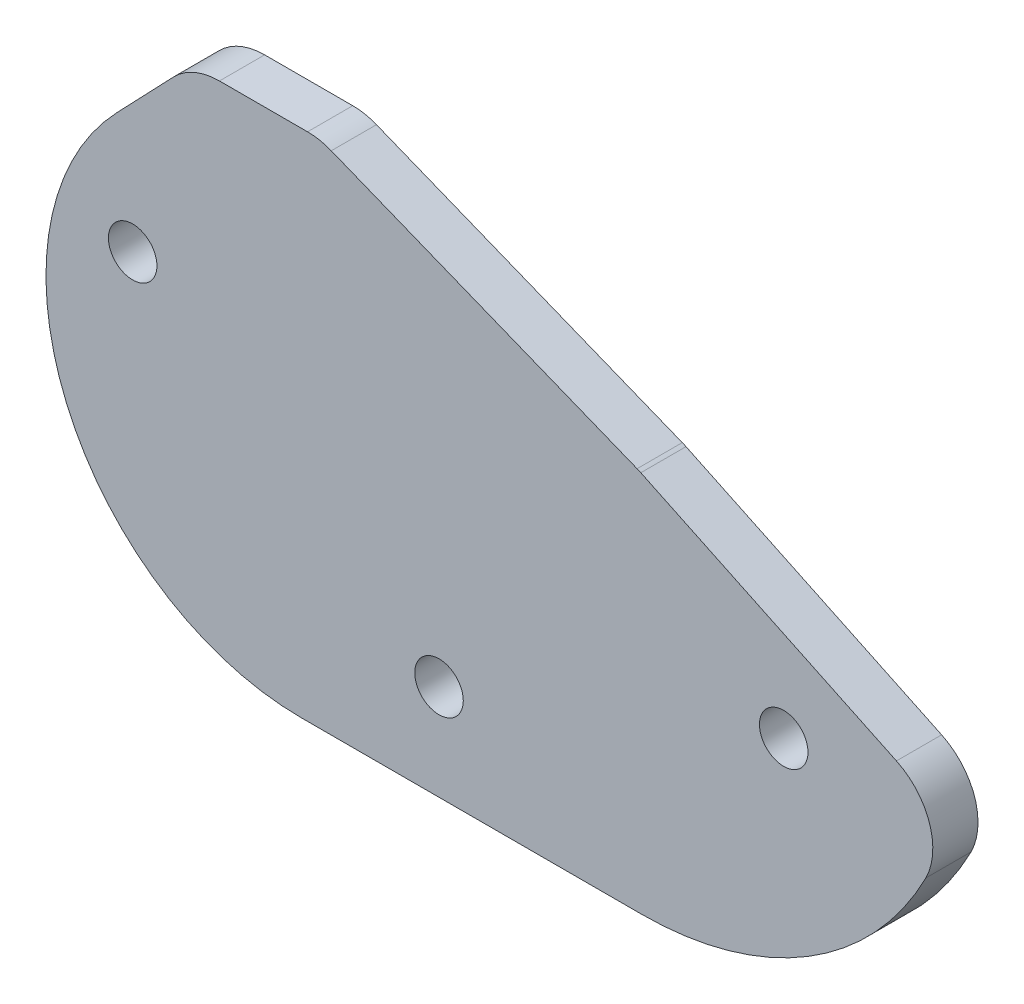
ISO-10303-21;
HEADER;
FILE_DESCRIPTION(('STEP AP214'),'2;1');
FILE_NAME('part.step','',(''),(''),'','','');
FILE_SCHEMA(('AUTOMOTIVE_DESIGN { 1 0 10303 214 1 1 1 1 }'));
ENDSEC;
DATA;
#1=APPLICATION_CONTEXT('core data for automotive mechanical design processes');
#2=APPLICATION_PROTOCOL_DEFINITION('international standard','automotive_design',2000,#1);
#3=PRODUCT_CONTEXT('',#1,'mechanical');
#4=PRODUCT('Part','Part','',(#3));
#5=PRODUCT_RELATED_PRODUCT_CATEGORY('part','',(#4));
#6=PRODUCT_DEFINITION_FORMATION('','',#4);
#7=PRODUCT_DEFINITION_CONTEXT('part definition',#1,'design');
#8=PRODUCT_DEFINITION('design','',#6,#7);
#9=PRODUCT_DEFINITION_SHAPE('','',#8);
#10=(LENGTH_UNIT() NAMED_UNIT(*) SI_UNIT(.MILLI.,.METRE.));
#11=(NAMED_UNIT(*) PLANE_ANGLE_UNIT() SI_UNIT($,.RADIAN.));
#12=(NAMED_UNIT(*) SI_UNIT($,.STERADIAN.) SOLID_ANGLE_UNIT());
#13=UNCERTAINTY_MEASURE_WITH_UNIT(LENGTH_MEASURE(1.E-05),#10,'distance_accuracy_value','');
#14=(GEOMETRIC_REPRESENTATION_CONTEXT(3) GLOBAL_UNCERTAINTY_ASSIGNED_CONTEXT((#13)) GLOBAL_UNIT_ASSIGNED_CONTEXT((#10,
#11,#12)) REPRESENTATION_CONTEXT('',''));
#15=CARTESIAN_POINT('',(0.,0.,0.));
#16=DIRECTION('',(0.,0.,1.));
#17=DIRECTION('',(1.,0.,0.));
#18=AXIS2_PLACEMENT_3D('',#15,#16,#17);
#19=CARTESIAN_POINT('',(101.6,0.,4.4958));
#20=DIRECTION('',(0.,1.,0.));
#21=DIRECTION('',(-1.,0.,0.));
#22=AXIS2_PLACEMENT_3D('',#19,#20,#21);
#23=PLANE('',#22);
#24=DIRECTION('',(0.,0.,1.));
#25=VECTOR('',#24,1.);
#26=CARTESIAN_POINT('',(70.9764049138577,0.,0.));
#27=LINE('',#26,#25);
#28=CARTESIAN_POINT('',(70.9764049138577,0.,0.));
#29=VERTEX_POINT('',#28);
#30=CARTESIAN_POINT('',(70.9764049138577,0.,4.4958));
#31=VERTEX_POINT('',#30);
#32=EDGE_CURVE('E129',#29,#31,#27,.T.);
#33=ORIENTED_EDGE('',*,*,#32,.T.);
#34=DIRECTION('',(1.,0.,0.));
#35=VECTOR('',#34,1.);
#36=CARTESIAN_POINT('',(101.6,0.,4.4958));
#37=LINE('',#36,#35);
#38=CARTESIAN_POINT('',(37.0944442407192,0.,4.4958));
#39=VERTEX_POINT('',#38);
#40=EDGE_CURVE('E161',#39,#31,#37,.T.);
#41=ORIENTED_EDGE('',*,*,#40,.F.);
#42=DIRECTION('',(0.,0.,1.));
#43=VECTOR('',#42,1.);
#44=CARTESIAN_POINT('',(37.0944442407192,0.,0.));
#45=LINE('',#44,#43);
#46=CARTESIAN_POINT('',(37.0944442407192,0.,0.));
#47=VERTEX_POINT('',#46);
#48=EDGE_CURVE('E141',#47,#39,#45,.T.);
#49=ORIENTED_EDGE('',*,*,#48,.F.);
#50=DIRECTION('',(1.,0.,0.));
#51=VECTOR('',#50,1.);
#52=CARTESIAN_POINT('',(101.6,0.,0.));
#53=LINE('',#52,#51);
#54=EDGE_CURVE('E124',#47,#29,#53,.T.);
#55=ORIENTED_EDGE('',*,*,#54,.T.);
#56=EDGE_LOOP('',(#33,#41,#49,#55));
#57=FACE_BOUND('',#56,.T.);
#58=ADVANCED_FACE('F33',(#57),#23,.F.);
#59=CARTESIAN_POINT('',(26.2420825003529,50.8,4.4958));
#60=DIRECTION('',(0.722605301638805,-0.69126086106729,0.));
#61=DIRECTION('',(0.69126086106729,0.722605301638805,0.));
#62=AXIS2_PLACEMENT_3D('',#59,#60,#61);
#63=PLANE('',#62);
#64=DIRECTION('',(-0.69126086106729,-0.722605301638805,0.));
#65=VECTOR('',#64,1.);
#66=CARTESIAN_POINT('',(26.2420825003529,50.8,4.4958));
#67=LINE('',#66,#65);
#68=CARTESIAN_POINT('',(24.366629270038,48.8395064677773,4.4958));
#69=VERTEX_POINT('',#68);
#70=CARTESIAN_POINT('',(18.7402695790936,42.9580258711092,4.4958));
#71=VERTEX_POINT('',#70);
#72=EDGE_CURVE('E152',#69,#71,#67,.T.);
#73=ORIENTED_EDGE('',*,*,#72,.F.);
#74=DIRECTION('',(0.,0.,-1.));
#75=VECTOR('',#74,1.);
#76=CARTESIAN_POINT('',(24.366629270038,48.8395064677773,4.4958));
#77=LINE('',#76,#75);
#78=CARTESIAN_POINT('',(24.366629270038,48.8395064677773,0.));
#79=VERTEX_POINT('',#78);
#80=EDGE_CURVE('E162',#69,#79,#77,.T.);
#81=ORIENTED_EDGE('',*,*,#80,.T.);
#82=DIRECTION('',(-0.69126086106729,-0.722605301638805,0.));
#83=VECTOR('',#82,1.);
#84=CARTESIAN_POINT('',(26.2420825003529,50.8,0.));
#85=LINE('',#84,#83);
#86=CARTESIAN_POINT('',(18.7402695790935,42.9580258711092,0.));
#87=VERTEX_POINT('',#86);
#88=EDGE_CURVE('E159',#79,#87,#85,.T.);
#89=ORIENTED_EDGE('',*,*,#88,.T.);
#90=DIRECTION('',(0.,0.,1.));
#91=VECTOR('',#90,1.);
#92=CARTESIAN_POINT('',(18.7402695790935,42.9580258711092,0.));
#93=LINE('',#92,#91);
#94=EDGE_CURVE('E235',#87,#71,#93,.T.);
#95=ORIENTED_EDGE('',*,*,#94,.T.);
#96=EDGE_LOOP('',(#73,#81,#89,#95));
#97=FACE_BOUND('',#96,.T.);
#98=ADVANCED_FACE('F249',(#97),#63,.F.);
#99=CARTESIAN_POINT('',(0.,0.,4.4958));
#100=DIRECTION('',(0.,0.,-1.));
#101=DIRECTION('',(-1.,0.,0.));
#102=AXIS2_PLACEMENT_3D('',#99,#100,#101);
#103=PLANE('',#102);
#104=DIRECTION('',(-1.,0.,0.));
#105=VECTOR('',#104,1.);
#106=CARTESIAN_POINT('',(26.2420825003529,50.8,4.4958));
#107=LINE('',#106,#105);
#108=CARTESIAN_POINT('',(37.7183314091178,50.8,4.4958));
#109=VERTEX_POINT('',#108);
#110=CARTESIAN_POINT('',(28.9551729354444,50.8,4.4958));
#111=VERTEX_POINT('',#110);
#112=EDGE_CURVE('E216',#109,#111,#107,.T.);
#113=ORIENTED_EDGE('',*,*,#112,.T.);
#114=CARTESIAN_POINT('',(28.9551729354445,44.45,4.4958));
#115=DIRECTION('',(0.,0.,-1.));
#116=DIRECTION('',(-1.,0.,0.));
#117=AXIS2_PLACEMENT_3D('',#114,#115,#116);
#118=CIRCLE('',#117,6.35);
#119=EDGE_CURVE('E182',#111,#69,#118,.F.);
#120=ORIENTED_EDGE('',*,*,#119,.T.);
#121=ORIENTED_EDGE('',*,*,#72,.T.);
#122=CARTESIAN_POINT('',(37.0944442407192,25.4,4.4958));
#123=DIRECTION('',(0.,0.,-1.));
#124=DIRECTION('',(1.,0.,0.));
#125=AXIS2_PLACEMENT_3D('',#122,#123,#124);
#126=CIRCLE('',#125,25.4);
#127=EDGE_CURVE('E138',#39,#71,#126,.T.);
#128=ORIENTED_EDGE('',*,*,#127,.F.);
#129=ORIENTED_EDGE('',*,*,#40,.T.);
#130=CARTESIAN_POINT('',(70.9764049138577,31.75,4.4958));
#131=DIRECTION('',(0.,0.,-1.));
#132=DIRECTION('',(-1.,0.,0.));
#133=AXIS2_PLACEMENT_3D('',#130,#131,#132);
#134=CIRCLE('',#133,31.75);
#135=CARTESIAN_POINT('',(99.2261027725313,17.2580342639913,4.4958));
#136=VERTEX_POINT('',#135);
#137=EDGE_CURVE('E130',#136,#31,#134,.T.);
#138=ORIENTED_EDGE('',*,*,#137,.F.);
#139=CARTESIAN_POINT('',(93.5761632007966,20.1564274111931,4.4958));
#140=DIRECTION('',(0.,0.,-1.));
#141=DIRECTION('',(-1.,0.,0.));
#142=AXIS2_PLACEMENT_3D('',#139,#140,#141);
#143=CIRCLE('',#142,6.35);
#144=CARTESIAN_POINT('',(96.3069073282395,25.8892745668772,4.4958));
#145=VERTEX_POINT('',#144);
#146=EDGE_CURVE('E177',#136,#145,#143,.F.);
#147=ORIENTED_EDGE('',*,*,#146,.T.);
#148=DIRECTION('',(-0.902810575698297,0.430038445266595,0.));
#149=VECTOR('',#148,1.);
#150=CARTESIAN_POINT('',(70.6920825003529,38.0904602211774,4.4958));
#151=LINE('',#150,#149);
#152=CARTESIAN_POINT('',(70.8749362686987,38.0033609421401,4.4958));
#153=VERTEX_POINT('',#152);
#154=EDGE_CURVE('E194',#145,#153,#151,.T.);
#155=ORIENTED_EDGE('',*,*,#154,.T.);
#156=CARTESIAN_POINT('',(68.1441921412558,32.2705137864559,4.4958));
#157=DIRECTION('',(0.,0.,-1.));
#158=DIRECTION('',(-1.,0.,0.));
#159=AXIS2_PLACEMENT_3D('',#156,#157,#158);
#160=CIRCLE('',#159,6.35);
#161=CARTESIAN_POINT('',(70.5040498474147,38.165729779673,4.4958));
#162=VERTEX_POINT('',#161);
#163=EDGE_CURVE('E55',#153,#162,#160,.F.);
#164=ORIENTED_EDGE('',*,*,#163,.T.);
#165=DIRECTION('',(-0.928380471372771,0.371631134828167,0.));
#166=VECTOR('',#165,1.);
#167=CARTESIAN_POINT('',(38.9420825003529,50.8,4.4958));
#168=LINE('',#167,#166);
#169=CARTESIAN_POINT('',(40.0781891152767,50.3452159932171,4.4958));
#170=VERTEX_POINT('',#169);
#171=EDGE_CURVE('E201',#162,#170,#168,.T.);
#172=ORIENTED_EDGE('',*,*,#171,.T.);
#173=CARTESIAN_POINT('',(37.7183314091178,44.45,4.4958));
#174=DIRECTION('',(0.,0.,-1.));
#175=DIRECTION('',(-1.,0.,0.));
#176=AXIS2_PLACEMENT_3D('',#173,#174,#175);
#177=CIRCLE('',#176,6.35);
#178=EDGE_CURVE('E180',#170,#109,#177,.F.);
#179=ORIENTED_EDGE('',*,*,#178,.T.);
#180=EDGE_LOOP('',(#113,#120,#121,#128,#129,#138,#147,#155,#164,#172,#179));
#181=FACE_BOUND('',#180,.T.);
#182=CARTESIAN_POINT('',(20.32,31.75,4.4958));
#183=DIRECTION('',(0.,0.,1.));
#184=DIRECTION('',(1.,0.,0.));
#185=AXIS2_PLACEMENT_3D('',#182,#183,#184);
#186=CIRCLE('',#185,2.413);
#187=CARTESIAN_POINT('',(22.733,31.75,4.4958));
#188=VERTEX_POINT('',#187);
#189=EDGE_CURVE('E143',#188,#188,#186,.T.);
#190=ORIENTED_EDGE('',*,*,#189,.F.);
#191=EDGE_LOOP('',(#190));
#192=FACE_BOUND('',#191,.T.);
#193=CARTESIAN_POINT('',(50.8,9.52499999999999,4.4958));
#194=DIRECTION('',(0.,0.,1.));
#195=DIRECTION('',(1.,0.,0.));
#196=AXIS2_PLACEMENT_3D('',#193,#194,#195);
#197=CIRCLE('',#196,2.41299999999999);
#198=CARTESIAN_POINT('',(53.213,9.52499999999999,4.4958));
#199=VERTEX_POINT('',#198);
#200=EDGE_CURVE('E222',#199,#199,#197,.T.);
#201=ORIENTED_EDGE('',*,*,#200,.F.);
#202=EDGE_LOOP('',(#201));
#203=FACE_BOUND('',#202,.T.);
#204=CARTESIAN_POINT('',(85.09,22.225,4.4958));
#205=DIRECTION('',(0.,0.,1.));
#206=DIRECTION('',(1.,0.,0.));
#207=AXIS2_PLACEMENT_3D('',#204,#205,#206);
#208=CIRCLE('',#207,2.413);
#209=CARTESIAN_POINT('',(87.503,22.225,4.4958));
#210=VERTEX_POINT('',#209);
#211=EDGE_CURVE('E227',#210,#210,#208,.T.);
#212=ORIENTED_EDGE('',*,*,#211,.F.);
#213=EDGE_LOOP('',(#212));
#214=FACE_BOUND('',#213,.T.);
#215=ADVANCED_FACE('F198',(#181,#192,#203,#214),#103,.F.);
#216=CARTESIAN_POINT('',(0.,0.,0.));
#217=DIRECTION('',(0.,0.,-1.));
#218=DIRECTION('',(-1.,0.,0.));
#219=AXIS2_PLACEMENT_3D('',#216,#217,#218);
#220=PLANE('',#219);
#221=ORIENTED_EDGE('',*,*,#88,.F.);
#222=CARTESIAN_POINT('',(28.9551729354445,44.45,0.));
#223=DIRECTION('',(0.,0.,-1.));
#224=DIRECTION('',(-1.,0.,0.));
#225=AXIS2_PLACEMENT_3D('',#222,#223,#224);
#226=CIRCLE('',#225,6.35);
#227=CARTESIAN_POINT('',(28.9551729354444,50.8,0.));
#228=VERTEX_POINT('',#227);
#229=EDGE_CURVE('E170',#79,#228,#226,.T.);
#230=ORIENTED_EDGE('',*,*,#229,.T.);
#231=DIRECTION('',(-1.,0.,0.));
#232=VECTOR('',#231,1.);
#233=CARTESIAN_POINT('',(26.2420825003529,50.8,0.));
#234=LINE('',#233,#232);
#235=CARTESIAN_POINT('',(37.7183314091178,50.8,0.));
#236=VERTEX_POINT('',#235);
#237=EDGE_CURVE('E156',#236,#228,#234,.T.);
#238=ORIENTED_EDGE('',*,*,#237,.F.);
#239=CARTESIAN_POINT('',(37.7183314091178,44.45,0.));
#240=DIRECTION('',(0.,0.,-1.));
#241=DIRECTION('',(-1.,0.,0.));
#242=AXIS2_PLACEMENT_3D('',#239,#240,#241);
#243=CIRCLE('',#242,6.35);
#244=CARTESIAN_POINT('',(40.0781891152767,50.3452159932171,0.));
#245=VERTEX_POINT('',#244);
#246=EDGE_CURVE('E168',#236,#245,#243,.T.);
#247=ORIENTED_EDGE('',*,*,#246,.T.);
#248=DIRECTION('',(-0.928380471372771,0.371631134828167,0.));
#249=VECTOR('',#248,1.);
#250=CARTESIAN_POINT('',(38.9420825003529,50.8,0.));
#251=LINE('',#250,#249);
#252=CARTESIAN_POINT('',(70.5040498474147,38.165729779673,0.));
#253=VERTEX_POINT('',#252);
#254=EDGE_CURVE('E146',#253,#245,#251,.T.);
#255=ORIENTED_EDGE('',*,*,#254,.F.);
#256=CARTESIAN_POINT('',(68.1441921412558,32.2705137864559,0.));
#257=DIRECTION('',(0.,0.,-1.));
#258=DIRECTION('',(-1.,0.,0.));
#259=AXIS2_PLACEMENT_3D('',#256,#257,#258);
#260=CIRCLE('',#259,6.35);
#261=CARTESIAN_POINT('',(70.8749362686987,38.0033609421401,0.));
#262=VERTEX_POINT('',#261);
#263=EDGE_CURVE('E166',#253,#262,#260,.T.);
#264=ORIENTED_EDGE('',*,*,#263,.T.);
#265=DIRECTION('',(-0.902810575698297,0.430038445266595,0.));
#266=VECTOR('',#265,1.);
#267=CARTESIAN_POINT('',(70.6920825003529,38.0904602211774,0.));
#268=LINE('',#267,#266);
#269=CARTESIAN_POINT('',(96.3069073282395,25.8892745668772,0.));
#270=VERTEX_POINT('',#269);
#271=EDGE_CURVE('E142',#270,#262,#268,.T.);
#272=ORIENTED_EDGE('',*,*,#271,.F.);
#273=CARTESIAN_POINT('',(93.5761632007966,20.1564274111931,0.));
#274=DIRECTION('',(0.,0.,-1.));
#275=DIRECTION('',(-1.,0.,0.));
#276=AXIS2_PLACEMENT_3D('',#273,#274,#275);
#277=CIRCLE('',#276,6.35);
#278=CARTESIAN_POINT('',(99.2261027725313,17.2580342639913,0.));
#279=VERTEX_POINT('',#278);
#280=EDGE_CURVE('E126',#270,#279,#277,.T.);
#281=ORIENTED_EDGE('',*,*,#280,.T.);
#282=CARTESIAN_POINT('',(70.9764049138577,31.75,0.));
#283=DIRECTION('',(0.,0.,-1.));
#284=DIRECTION('',(-1.,0.,0.));
#285=AXIS2_PLACEMENT_3D('',#282,#283,#284);
#286=CIRCLE('',#285,31.75);
#287=EDGE_CURVE('E117',#279,#29,#286,.T.);
#288=ORIENTED_EDGE('',*,*,#287,.T.);
#289=ORIENTED_EDGE('',*,*,#54,.F.);
#290=CARTESIAN_POINT('',(37.0944442407192,25.4,0.));
#291=DIRECTION('',(0.,0.,-1.));
#292=DIRECTION('',(1.,0.,0.));
#293=AXIS2_PLACEMENT_3D('',#290,#291,#292);
#294=CIRCLE('',#293,25.4);
#295=EDGE_CURVE('E238',#47,#87,#294,.T.);
#296=ORIENTED_EDGE('',*,*,#295,.T.);
#297=EDGE_LOOP('',(#221,#230,#238,#247,#255,#264,#272,#281,#288,#289,#296));
#298=FACE_BOUND('',#297,.T.);
#299=CARTESIAN_POINT('',(50.8,9.52499999999999,0.));
#300=DIRECTION('',(0.,0.,1.));
#301=DIRECTION('',(1.,0.,0.));
#302=AXIS2_PLACEMENT_3D('',#299,#300,#301);
#303=CIRCLE('',#302,2.41299999999999);
#304=CARTESIAN_POINT('',(53.213,9.52499999999999,0.));
#305=VERTEX_POINT('',#304);
#306=EDGE_CURVE('E224',#305,#305,#303,.T.);
#307=ORIENTED_EDGE('',*,*,#306,.T.);
#308=EDGE_LOOP('',(#307));
#309=FACE_BOUND('',#308,.T.);
#310=CARTESIAN_POINT('',(20.32,31.75,0.));
#311=DIRECTION('',(0.,0.,1.));
#312=DIRECTION('',(1.,0.,0.));
#313=AXIS2_PLACEMENT_3D('',#310,#311,#312);
#314=CIRCLE('',#313,2.413);
#315=CARTESIAN_POINT('',(22.733,31.75,0.));
#316=VERTEX_POINT('',#315);
#317=EDGE_CURVE('E149',#316,#316,#314,.T.);
#318=ORIENTED_EDGE('',*,*,#317,.T.);
#319=EDGE_LOOP('',(#318));
#320=FACE_BOUND('',#319,.T.);
#321=CARTESIAN_POINT('',(85.09,22.225,0.));
#322=DIRECTION('',(0.,0.,1.));
#323=DIRECTION('',(1.,0.,0.));
#324=AXIS2_PLACEMENT_3D('',#321,#322,#323);
#325=CIRCLE('',#324,2.413);
#326=CARTESIAN_POINT('',(87.503,22.225,0.));
#327=VERTEX_POINT('',#326);
#328=EDGE_CURVE('E230',#327,#327,#325,.T.);
#329=ORIENTED_EDGE('',*,*,#328,.T.);
#330=EDGE_LOOP('',(#329));
#331=FACE_BOUND('',#330,.T.);
#332=ADVANCED_FACE('F120',(#298,#309,#320,#331),#220,.T.);
#333=CARTESIAN_POINT('',(70.6920825003529,38.0904602211774,4.4958));
#334=DIRECTION('',(-0.430038445266595,-0.902810575698296,0.));
#335=DIRECTION('',(0.902810575698297,-0.430038445266595,0.));
#336=AXIS2_PLACEMENT_3D('',#333,#334,#335);
#337=PLANE('',#336);
#338=ORIENTED_EDGE('',*,*,#271,.T.);
#339=DIRECTION('',(0.,0.,-1.));
#340=VECTOR('',#339,1.);
#341=CARTESIAN_POINT('',(70.8749362686987,38.0033609421401,4.4958));
#342=LINE('',#341,#340);
#343=EDGE_CURVE('E41',#262,#153,#342,.F.);
#344=ORIENTED_EDGE('',*,*,#343,.T.);
#345=ORIENTED_EDGE('',*,*,#154,.F.);
#346=DIRECTION('',(0.,0.,1.));
#347=VECTOR('',#346,1.);
#348=CARTESIAN_POINT('',(96.3069073282395,25.8892745668772,4.4958));
#349=LINE('',#348,#347);
#350=EDGE_CURVE('E188',#145,#270,#349,.F.);
#351=ORIENTED_EDGE('',*,*,#350,.T.);
#352=EDGE_LOOP('',(#338,#344,#345,#351));
#353=FACE_BOUND('',#352,.T.);
#354=ADVANCED_FACE('F193',(#353),#337,.F.);
#355=CARTESIAN_POINT('',(38.9420825003529,50.8,4.4958));
#356=DIRECTION('',(-0.371631134828167,-0.928380471372771,0.));
#357=DIRECTION('',(0.928380471372771,-0.371631134828167,0.));
#358=AXIS2_PLACEMENT_3D('',#355,#356,#357);
#359=PLANE('',#358);
#360=ORIENTED_EDGE('',*,*,#254,.T.);
#361=DIRECTION('',(0.,0.,-1.));
#362=VECTOR('',#361,1.);
#363=CARTESIAN_POINT('',(40.0781891152767,50.3452159932171,4.4958));
#364=LINE('',#363,#362);
#365=EDGE_CURVE('E48',#245,#170,#364,.F.);
#366=ORIENTED_EDGE('',*,*,#365,.T.);
#367=ORIENTED_EDGE('',*,*,#171,.F.);
#368=DIRECTION('',(0.,0.,-1.));
#369=VECTOR('',#368,1.);
#370=CARTESIAN_POINT('',(70.5040498474147,38.165729779673,4.4958));
#371=LINE('',#370,#369);
#372=EDGE_CURVE('E184',#162,#253,#371,.T.);
#373=ORIENTED_EDGE('',*,*,#372,.T.);
#374=EDGE_LOOP('',(#360,#366,#367,#373));
#375=FACE_BOUND('',#374,.T.);
#376=ADVANCED_FACE('F206',(#375),#359,.F.);
#377=CARTESIAN_POINT('',(26.2420825003529,50.8,4.4958));
#378=DIRECTION('',(0.,-1.,0.));
#379=DIRECTION('',(1.,0.,0.));
#380=AXIS2_PLACEMENT_3D('',#377,#378,#379);
#381=PLANE('',#380);
#382=ORIENTED_EDGE('',*,*,#237,.T.);
#383=DIRECTION('',(0.,0.,-1.));
#384=VECTOR('',#383,1.);
#385=CARTESIAN_POINT('',(28.9551729354444,50.8,4.4958));
#386=LINE('',#385,#384);
#387=EDGE_CURVE('E175',#228,#111,#386,.F.);
#388=ORIENTED_EDGE('',*,*,#387,.T.);
#389=ORIENTED_EDGE('',*,*,#112,.F.);
#390=DIRECTION('',(0.,0.,-1.));
#391=VECTOR('',#390,1.);
#392=CARTESIAN_POINT('',(37.7183314091178,50.8,4.4958));
#393=LINE('',#392,#391);
#394=EDGE_CURVE('E172',#109,#236,#393,.T.);
#395=ORIENTED_EDGE('',*,*,#394,.T.);
#396=EDGE_LOOP('',(#382,#388,#389,#395));
#397=FACE_BOUND('',#396,.T.);
#398=ADVANCED_FACE('F214',(#397),#381,.F.);
#399=CARTESIAN_POINT('',(20.32,31.75,4.4958));
#400=DIRECTION('',(0.,0.,-1.));
#401=DIRECTION('',(-1.,0.,0.));
#402=AXIS2_PLACEMENT_3D('',#399,#400,#401);
#403=CYLINDRICAL_SURFACE('',#402,2.413);
#404=ORIENTED_EDGE('',*,*,#189,.T.);
#405=EDGE_LOOP('',(#404));
#406=FACE_BOUND('',#405,.T.);
#407=ORIENTED_EDGE('',*,*,#317,.F.);
#408=EDGE_LOOP('',(#407));
#409=FACE_BOUND('',#408,.T.);
#410=ADVANCED_FACE('F333',(#406,#409),#403,.F.);
#411=CARTESIAN_POINT('',(50.8,9.52499999999999,4.4958));
#412=DIRECTION('',(0.,0.,-1.));
#413=DIRECTION('',(-1.,0.,0.));
#414=AXIS2_PLACEMENT_3D('',#411,#412,#413);
#415=CYLINDRICAL_SURFACE('',#414,2.41299999999999);
#416=ORIENTED_EDGE('',*,*,#200,.T.);
#417=EDGE_LOOP('',(#416));
#418=FACE_BOUND('',#417,.T.);
#419=ORIENTED_EDGE('',*,*,#306,.F.);
#420=EDGE_LOOP('',(#419));
#421=FACE_BOUND('',#420,.T.);
#422=ADVANCED_FACE('F324',(#418,#421),#415,.F.);
#423=CARTESIAN_POINT('',(85.09,22.225,4.4958));
#424=DIRECTION('',(0.,0.,-1.));
#425=DIRECTION('',(-1.,0.,0.));
#426=AXIS2_PLACEMENT_3D('',#423,#424,#425);
#427=CYLINDRICAL_SURFACE('',#426,2.413);
#428=ORIENTED_EDGE('',*,*,#211,.T.);
#429=EDGE_LOOP('',(#428));
#430=FACE_BOUND('',#429,.T.);
#431=ORIENTED_EDGE('',*,*,#328,.F.);
#432=EDGE_LOOP('',(#431));
#433=FACE_BOUND('',#432,.T.);
#434=ADVANCED_FACE('F306',(#430,#433),#427,.F.);
#435=CARTESIAN_POINT('',(37.0944442407192,25.4,0.));
#436=DIRECTION('',(0.,0.,1.));
#437=DIRECTION('',(1.,0.,0.));
#438=AXIS2_PLACEMENT_3D('',#435,#436,#437);
#439=CYLINDRICAL_SURFACE('',#438,25.4);
#440=ORIENTED_EDGE('',*,*,#127,.T.);
#441=ORIENTED_EDGE('',*,*,#94,.F.);
#442=ORIENTED_EDGE('',*,*,#295,.F.);
#443=ORIENTED_EDGE('',*,*,#48,.T.);
#444=EDGE_LOOP('',(#440,#441,#442,#443));
#445=FACE_BOUND('',#444,.T.);
#446=ADVANCED_FACE('F245',(#445),#439,.T.);
#447=CARTESIAN_POINT('',(70.9764049138577,31.75,0.));
#448=DIRECTION('',(0.,0.,1.));
#449=DIRECTION('',(1.,0.,0.));
#450=AXIS2_PLACEMENT_3D('',#447,#448,#449);
#451=CYLINDRICAL_SURFACE('',#450,31.75);
#452=ORIENTED_EDGE('',*,*,#287,.F.);
#453=DIRECTION('',(0.,0.,1.));
#454=VECTOR('',#453,1.);
#455=CARTESIAN_POINT('',(99.2261027725313,17.2580342639913,0.));
#456=LINE('',#455,#454);
#457=EDGE_CURVE('E11',#279,#136,#456,.T.);
#458=ORIENTED_EDGE('',*,*,#457,.T.);
#459=ORIENTED_EDGE('',*,*,#137,.T.);
#460=ORIENTED_EDGE('',*,*,#32,.F.);
#461=EDGE_LOOP('',(#452,#458,#459,#460));
#462=FACE_BOUND('',#461,.T.);
#463=ADVANCED_FACE('F133',(#462),#451,.T.);
#464=CARTESIAN_POINT('',(28.9551729354445,44.45,4.4958));
#465=DIRECTION('',(0.,0.,-1.));
#466=DIRECTION('',(-1.,0.,0.));
#467=AXIS2_PLACEMENT_3D('',#464,#465,#466);
#468=CYLINDRICAL_SURFACE('',#467,6.35);
#469=ORIENTED_EDGE('',*,*,#119,.F.);
#470=ORIENTED_EDGE('',*,*,#387,.F.);
#471=ORIENTED_EDGE('',*,*,#229,.F.);
#472=ORIENTED_EDGE('',*,*,#80,.F.);
#473=EDGE_LOOP('',(#469,#470,#471,#472));
#474=FACE_BOUND('',#473,.T.);
#475=ADVANCED_FACE('F252',(#474),#468,.T.);
#476=CARTESIAN_POINT('',(37.7183314091178,44.45,4.4958));
#477=DIRECTION('',(0.,0.,-1.));
#478=DIRECTION('',(-1.,0.,0.));
#479=AXIS2_PLACEMENT_3D('',#476,#477,#478);
#480=CYLINDRICAL_SURFACE('',#479,6.35);
#481=ORIENTED_EDGE('',*,*,#178,.F.);
#482=ORIENTED_EDGE('',*,*,#365,.F.);
#483=ORIENTED_EDGE('',*,*,#246,.F.);
#484=ORIENTED_EDGE('',*,*,#394,.F.);
#485=EDGE_LOOP('',(#481,#482,#483,#484));
#486=FACE_BOUND('',#485,.T.);
#487=ADVANCED_FACE('F211',(#486),#480,.T.);
#488=CARTESIAN_POINT('',(68.1441921412558,32.2705137864559,4.4958));
#489=DIRECTION('',(0.,0.,-1.));
#490=DIRECTION('',(-1.,0.,0.));
#491=AXIS2_PLACEMENT_3D('',#488,#489,#490);
#492=CYLINDRICAL_SURFACE('',#491,6.35);
#493=ORIENTED_EDGE('',*,*,#163,.F.);
#494=ORIENTED_EDGE('',*,*,#343,.F.);
#495=ORIENTED_EDGE('',*,*,#263,.F.);
#496=ORIENTED_EDGE('',*,*,#372,.F.);
#497=EDGE_LOOP('',(#493,#494,#495,#496));
#498=FACE_BOUND('',#497,.T.);
#499=ADVANCED_FACE('F204',(#498),#492,.T.);
#500=CARTESIAN_POINT('',(93.5761632007966,20.1564274111931,0.));
#501=DIRECTION('',(0.,0.,1.));
#502=DIRECTION('',(1.,0.,0.));
#503=AXIS2_PLACEMENT_3D('',#500,#501,#502);
#504=CYLINDRICAL_SURFACE('',#503,6.35);
#505=ORIENTED_EDGE('',*,*,#146,.F.);
#506=ORIENTED_EDGE('',*,*,#457,.F.);
#507=ORIENTED_EDGE('',*,*,#280,.F.);
#508=ORIENTED_EDGE('',*,*,#350,.F.);
#509=EDGE_LOOP('',(#505,#506,#507,#508));
#510=FACE_BOUND('',#509,.T.);
#511=ADVANCED_FACE('F35',(#510),#504,.T.);
#512=CLOSED_SHELL('',(#58,#98,#215,#332,#354,#376,#398,#410,#422,#434,#446,#463,#475,#487,#499,#511));
#513=MANIFOLD_SOLID_BREP('B2',#512);
#514=ADVANCED_BREP_SHAPE_REPRESENTATION('',(#18,#513),#14);
#515=SHAPE_DEFINITION_REPRESENTATION(#9,#514);
ENDSEC;
END-ISO-10303-21;
